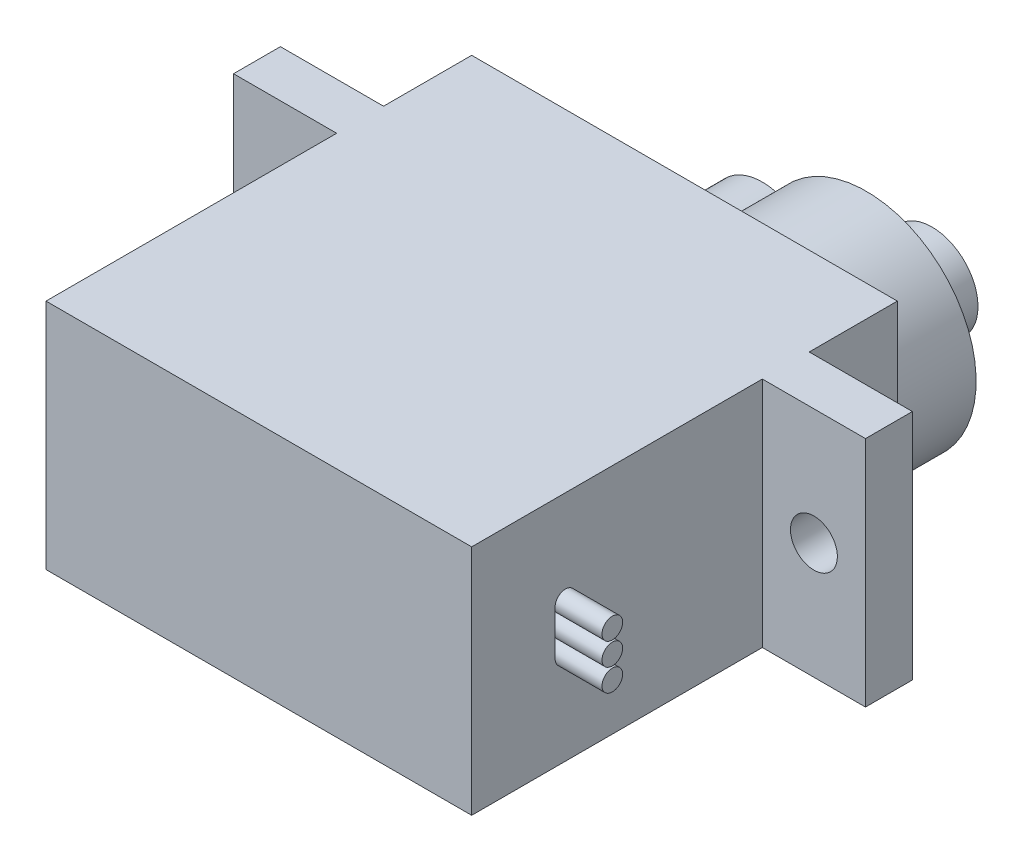
ISO-10303-21;
HEADER;
FILE_DESCRIPTION(('STEP AP214'),'2;1');
FILE_NAME('part.step','',(''),(''),'','','');
FILE_SCHEMA(('AUTOMOTIVE_DESIGN { 1 0 10303 214 1 1 1 1 }'));
ENDSEC;
DATA;
#1=APPLICATION_CONTEXT('core data for automotive mechanical design processes');
#2=APPLICATION_PROTOCOL_DEFINITION('international standard','automotive_design',2000,#1);
#3=PRODUCT_CONTEXT('',#1,'mechanical');
#4=PRODUCT('Part','Part','',(#3));
#5=PRODUCT_RELATED_PRODUCT_CATEGORY('part','',(#4));
#6=PRODUCT_DEFINITION_FORMATION('','',#4);
#7=PRODUCT_DEFINITION_CONTEXT('part definition',#1,'design');
#8=PRODUCT_DEFINITION('design','',#6,#7);
#9=PRODUCT_DEFINITION_SHAPE('','',#8);
#10=(LENGTH_UNIT() NAMED_UNIT(*) SI_UNIT(.MILLI.,.METRE.));
#11=(NAMED_UNIT(*) PLANE_ANGLE_UNIT() SI_UNIT($,.RADIAN.));
#12=(NAMED_UNIT(*) SI_UNIT($,.STERADIAN.) SOLID_ANGLE_UNIT());
#13=UNCERTAINTY_MEASURE_WITH_UNIT(LENGTH_MEASURE(1.E-05),#10,'distance_accuracy_value','');
#14=(GEOMETRIC_REPRESENTATION_CONTEXT(3) GLOBAL_UNCERTAINTY_ASSIGNED_CONTEXT((#13)) GLOBAL_UNIT_ASSIGNED_CONTEXT((#10,
#11,#12)) REPRESENTATION_CONTEXT('',''));
#15=CARTESIAN_POINT('',(0.,0.,0.));
#16=DIRECTION('',(0.,0.,1.));
#17=DIRECTION('',(1.,0.,0.));
#18=AXIS2_PLACEMENT_3D('',#15,#16,#17);
#19=CARTESIAN_POINT('',(0.199999999999997,-60.1690603051343,17.7));
#20=DIRECTION('',(-1.,0.,0.));
#21=DIRECTION('',(0.,-1.,0.));
#22=AXIS2_PLACEMENT_3D('',#19,#20,#21);
#23=CYLINDRICAL_SURFACE('',#22,0.549999999999984);
#24=CARTESIAN_POINT('',(0.199999999999997,-60.1690603051343,17.7));
#25=DIRECTION('',(1.,0.,0.));
#26=DIRECTION('',(0.,1.,0.));
#27=AXIS2_PLACEMENT_3D('',#24,#25,#26);
#28=CIRCLE('',#27,0.549999999999984);
#29=CARTESIAN_POINT('',(0.199999999999997,-59.6190603051344,17.7));
#30=VERTEX_POINT('',#29);
#31=EDGE_CURVE('E323',#30,#30,#28,.T.);
#32=ORIENTED_EDGE('',*,*,#31,.F.);
#33=EDGE_LOOP('',(#32));
#34=FACE_BOUND('',#33,.T.);
#35=CARTESIAN_POINT('',(-2.8,-60.1690603051343,17.7));
#36=DIRECTION('',(1.,0.,0.));
#37=DIRECTION('',(0.,1.,0.));
#38=AXIS2_PLACEMENT_3D('',#35,#36,#37);
#39=CIRCLE('',#38,0.549999999999984);
#40=CARTESIAN_POINT('',(-2.8,-59.6190603051344,17.7));
#41=VERTEX_POINT('',#40);
#42=EDGE_CURVE('E20',#41,#41,#39,.T.);
#43=ORIENTED_EDGE('',*,*,#42,.T.);
#44=EDGE_LOOP('',(#43));
#45=FACE_BOUND('',#44,.T.);
#46=ADVANCED_FACE('F18',(#34,#45),#23,.T.);
#47=CARTESIAN_POINT('',(0.199999999999997,-60.1690603051343,17.7));
#48=DIRECTION('',(1.,0.,0.));
#49=DIRECTION('',(0.,1.,0.));
#50=AXIS2_PLACEMENT_3D('',#47,#48,#49);
#51=PLANE('',#50);
#52=ORIENTED_EDGE('',*,*,#31,.T.);
#53=EDGE_LOOP('',(#52));
#54=FACE_BOUND('',#53,.T.);
#55=ADVANCED_FACE('F453',(#54),#51,.T.);
#56=CARTESIAN_POINT('',(-2.8,-60.1690603051343,17.7));
#57=DIRECTION('',(1.,0.,0.));
#58=DIRECTION('',(0.,1.,0.));
#59=AXIS2_PLACEMENT_3D('',#56,#57,#58);
#60=PLANE('',#59);
#61=ORIENTED_EDGE('',*,*,#42,.F.);
#62=EDGE_LOOP('',(#61));
#63=FACE_BOUND('',#62,.T.);
#64=ADVANCED_FACE('F449',(#63),#60,.F.);
#65=CLOSED_SHELL('',(#46,#55,#64));
#66=MANIFOLD_SOLID_BREP('B1',#65);
#67=CARTESIAN_POINT('',(-25.,-53.9690603051343,22.7));
#68=DIRECTION('',(1.,0.,0.));
#69=DIRECTION('',(0.,0.,-1.));
#70=AXIS2_PLACEMENT_3D('',#67,#68,#69);
#71=PLANE('',#70);
#72=DIRECTION('',(0.,0.,-1.));
#73=VECTOR('',#72,1.);
#74=CARTESIAN_POINT('',(-25.,-66.3690603051343,22.7));
#75=LINE('',#74,#73);
#76=CARTESIAN_POINT('',(-25.0000000000419,-66.3690603051344,4.7));
#77=VERTEX_POINT('',#76);
#78=CARTESIAN_POINT('',(-25.,-66.3690603051343,0.));
#79=VERTEX_POINT('',#78);
#80=EDGE_CURVE('E437',#77,#79,#75,.T.);
#81=ORIENTED_EDGE('',*,*,#80,.F.);
#82=DIRECTION('',(0.,1.,0.));
#83=VECTOR('',#82,1.);
#84=CARTESIAN_POINT('',(-25.0000000000419,-66.3690603051344,4.7));
#85=LINE('',#84,#83);
#86=CARTESIAN_POINT('',(-25.0000000000419,-53.9690603051344,4.7));
#87=VERTEX_POINT('',#86);
#88=EDGE_CURVE('E245',#77,#87,#85,.T.);
#89=ORIENTED_EDGE('',*,*,#88,.T.);
#90=DIRECTION('',(0.,0.,-1.));
#91=VECTOR('',#90,1.);
#92=CARTESIAN_POINT('',(-25.,-53.9690603051343,22.7));
#93=LINE('',#92,#91);
#94=CARTESIAN_POINT('',(-25.,-53.9690603051343,0.));
#95=VERTEX_POINT('',#94);
#96=EDGE_CURVE('E405',#87,#95,#93,.T.);
#97=ORIENTED_EDGE('',*,*,#96,.T.);
#98=DIRECTION('',(0.,-1.,0.));
#99=VECTOR('',#98,1.);
#100=CARTESIAN_POINT('',(-25.,-53.9690603051343,0.));
#101=LINE('',#100,#99);
#102=EDGE_CURVE('E390',#95,#79,#101,.T.);
#103=ORIENTED_EDGE('',*,*,#102,.T.);
#104=EDGE_LOOP('',(#81,#89,#97,#103));
#105=FACE_BOUND('',#104,.T.);
#106=ADVANCED_FACE('F16',(#105),#71,.F.);
#107=CARTESIAN_POINT('',(-2.3,-66.3690603051343,22.7));
#108=DIRECTION('',(-1.,0.,0.));
#109=DIRECTION('',(0.,0.,1.));
#110=AXIS2_PLACEMENT_3D('',#107,#108,#109);
#111=PLANE('',#110);
#112=CARTESIAN_POINT('',(-2.3,-61.3690603051343,17.7));
#113=DIRECTION('',(-1.,0.,0.));
#114=DIRECTION('',(0.,1.,0.));
#115=AXIS2_PLACEMENT_3D('',#112,#113,#114);
#116=CIRCLE('',#115,0.55);
#117=CARTESIAN_POINT('',(-2.3,-61.3690603051343,17.15));
#118=VERTEX_POINT('',#117);
#119=CARTESIAN_POINT('',(-2.3,-61.3690603051343,18.25));
#120=VERTEX_POINT('',#119);
#121=EDGE_CURVE('E327',#118,#120,#116,.T.);
#122=ORIENTED_EDGE('',*,*,#121,.T.);
#123=DIRECTION('',(0.,1.,0.));
#124=VECTOR('',#123,1.);
#125=CARTESIAN_POINT('',(-2.3,-61.3690603051343,18.25));
#126=LINE('',#125,#124);
#127=CARTESIAN_POINT('',(-2.3,-58.9690603051344,18.25));
#128=VERTEX_POINT('',#127);
#129=EDGE_CURVE('E340',#120,#128,#126,.T.);
#130=ORIENTED_EDGE('',*,*,#129,.T.);
#131=CARTESIAN_POINT('',(-2.3,-58.9690603051344,17.7));
#132=DIRECTION('',(-1.,0.,0.));
#133=DIRECTION('',(0.,1.,0.));
#134=AXIS2_PLACEMENT_3D('',#131,#132,#133);
#135=CIRCLE('',#134,0.55);
#136=CARTESIAN_POINT('',(-2.3,-58.9690603051344,17.15));
#137=VERTEX_POINT('',#136);
#138=EDGE_CURVE('E344',#128,#137,#135,.T.);
#139=ORIENTED_EDGE('',*,*,#138,.T.);
#140=DIRECTION('',(0.,-1.,0.));
#141=VECTOR('',#140,1.);
#142=CARTESIAN_POINT('',(-2.3,-58.9690603051344,17.15));
#143=LINE('',#142,#141);
#144=EDGE_CURVE('E335',#137,#118,#143,.T.);
#145=ORIENTED_EDGE('',*,*,#144,.T.);
#146=EDGE_LOOP('',(#122,#130,#139,#145));
#147=FACE_BOUND('',#146,.T.);
#148=DIRECTION('',(0.,-1.,0.));
#149=VECTOR('',#148,1.);
#150=CARTESIAN_POINT('',(-2.29999999995811,-53.9690603051343,7.2));
#151=LINE('',#150,#149);
#152=CARTESIAN_POINT('',(-2.29999999995811,-53.9690603051343,7.2));
#153=VERTEX_POINT('',#152);
#154=CARTESIAN_POINT('',(-2.29999999995811,-66.3690603051343,7.2));
#155=VERTEX_POINT('',#154);
#156=EDGE_CURVE('E298',#153,#155,#151,.T.);
#157=ORIENTED_EDGE('',*,*,#156,.F.);
#158=DIRECTION('',(0.,0.,-1.));
#159=VECTOR('',#158,1.);
#160=CARTESIAN_POINT('',(-2.3,-53.9690603051343,22.7));
#161=LINE('',#160,#159);
#162=CARTESIAN_POINT('',(-2.3,-53.9690603051343,22.7));
#163=VERTEX_POINT('',#162);
#164=EDGE_CURVE('E428',#163,#153,#161,.T.);
#165=ORIENTED_EDGE('',*,*,#164,.F.);
#166=DIRECTION('',(0.,1.,0.));
#167=VECTOR('',#166,1.);
#168=CARTESIAN_POINT('',(-2.3,-66.3690603051343,22.7));
#169=LINE('',#168,#167);
#170=CARTESIAN_POINT('',(-2.3,-66.3690603051343,22.7));
#171=VERTEX_POINT('',#170);
#172=EDGE_CURVE('E398',#171,#163,#169,.T.);
#173=ORIENTED_EDGE('',*,*,#172,.F.);
#174=DIRECTION('',(0.,0.,-1.));
#175=VECTOR('',#174,1.);
#176=CARTESIAN_POINT('',(-2.3,-66.3690603051343,22.7));
#177=LINE('',#176,#175);
#178=EDGE_CURVE('E433',#171,#155,#177,.T.);
#179=ORIENTED_EDGE('',*,*,#178,.T.);
#180=EDGE_LOOP('',(#157,#165,#173,#179));
#181=FACE_BOUND('',#180,.T.);
#182=ADVANCED_FACE('F507',(#147,#181),#111,.F.);
#183=DIRECTION('',(0.,1.,0.));
#184=VECTOR('',#183,1.);
#185=CARTESIAN_POINT('',(-2.29999999995811,-66.3690603051343,4.7));
#186=LINE('',#185,#184);
#187=CARTESIAN_POINT('',(-2.29999999995811,-66.3690603051343,4.7));
#188=VERTEX_POINT('',#187);
#189=CARTESIAN_POINT('',(-2.3,-53.9690603051343,4.7));
#190=VERTEX_POINT('',#189);
#191=EDGE_CURVE('E281',#188,#190,#186,.T.);
#192=ORIENTED_EDGE('',*,*,#191,.F.);
#193=CARTESIAN_POINT('',(-2.3,-66.3690603051343,0.));
#194=VERTEX_POINT('',#193);
#195=EDGE_CURVE('E432',#188,#194,#177,.T.);
#196=ORIENTED_EDGE('',*,*,#195,.T.);
#197=DIRECTION('',(0.,1.,0.));
#198=VECTOR('',#197,1.);
#199=CARTESIAN_POINT('',(-2.3,-66.3690603051343,0.));
#200=LINE('',#199,#198);
#201=CARTESIAN_POINT('',(-2.3,-53.9690603051343,0.));
#202=VERTEX_POINT('',#201);
#203=EDGE_CURVE('E413',#194,#202,#200,.T.);
#204=ORIENTED_EDGE('',*,*,#203,.T.);
#205=EDGE_CURVE('E427',#190,#202,#161,.T.);
#206=ORIENTED_EDGE('',*,*,#205,.F.);
#207=EDGE_LOOP('',(#192,#196,#204,#206));
#208=FACE_BOUND('',#207,.T.);
#209=ADVANCED_FACE('F502',(#208),#111,.F.);
#210=CARTESIAN_POINT('',(-2.8,-61.3690603051343,17.7));
#211=DIRECTION('',(-1.,0.,0.));
#212=DIRECTION('',(0.,1.,0.));
#213=AXIS2_PLACEMENT_3D('',#210,#211,#212);
#214=PLANE('',#213);
#215=CARTESIAN_POINT('',(-2.8,-61.3690603051343,17.7));
#216=DIRECTION('',(1.,0.,0.));
#217=DIRECTION('',(0.,1.,0.));
#218=AXIS2_PLACEMENT_3D('',#215,#216,#217);
#219=CIRCLE('',#218,0.549999999999984);
#220=CARTESIAN_POINT('',(-2.8,-61.3690603051343,17.15));
#221=VERTEX_POINT('',#220);
#222=CARTESIAN_POINT('',(-2.8,-61.3690603051343,18.25));
#223=VERTEX_POINT('',#222);
#224=EDGE_CURVE('E320',#221,#223,#219,.T.);
#225=ORIENTED_EDGE('',*,*,#224,.F.);
#226=DIRECTION('',(0.,-1.,0.));
#227=VECTOR('',#226,1.);
#228=CARTESIAN_POINT('',(-2.8,-58.9690603051344,17.15));
#229=LINE('',#228,#227);
#230=CARTESIAN_POINT('',(-2.8,-58.9690603051344,17.15));
#231=VERTEX_POINT('',#230);
#232=EDGE_CURVE('E334',#231,#221,#229,.T.);
#233=ORIENTED_EDGE('',*,*,#232,.F.);
#234=CARTESIAN_POINT('',(-2.8,-58.9690603051344,17.7));
#235=DIRECTION('',(1.,0.,0.));
#236=DIRECTION('',(0.,1.,0.));
#237=AXIS2_PLACEMENT_3D('',#234,#235,#236);
#238=CIRCLE('',#237,0.549999999999984);
#239=CARTESIAN_POINT('',(-2.8,-58.9690603051344,18.25));
#240=VERTEX_POINT('',#239);
#241=EDGE_CURVE('E319',#240,#231,#238,.T.);
#242=ORIENTED_EDGE('',*,*,#241,.F.);
#243=DIRECTION('',(0.,1.,0.));
#244=VECTOR('',#243,1.);
#245=CARTESIAN_POINT('',(-2.8,-61.3690603051343,18.25));
#246=LINE('',#245,#244);
#247=EDGE_CURVE('E330',#223,#240,#246,.T.);
#248=ORIENTED_EDGE('',*,*,#247,.F.);
#249=EDGE_LOOP('',(#225,#233,#242,#248));
#250=FACE_BOUND('',#249,.T.);
#251=ADVANCED_FACE('F506',(#250),#214,.F.);
#252=CARTESIAN_POINT('',(-8.65,-60.2733667044182,-4.7));
#253=DIRECTION('',(0.,0.,1.));
#254=DIRECTION('',(-1.,0.,0.));
#255=AXIS2_PLACEMENT_3D('',#252,#253,#254);
#256=CYLINDRICAL_SURFACE('',#255,5.85);
#257=DIRECTION('',(0.,0.,1.));
#258=VECTOR('',#257,1.);
#259=CARTESIAN_POINT('',(-14.1122706823838,-62.3676682568149,-2.35));
#260=LINE('',#259,#258);
#261=CARTESIAN_POINT('',(-14.1122706823838,-62.3676682568149,-4.7));
#262=VERTEX_POINT('',#261);
#263=CARTESIAN_POINT('',(-14.1122706823838,-62.3676682568149,0.));
#264=VERTEX_POINT('',#263);
#265=EDGE_CURVE('E379',#262,#264,#260,.T.);
#266=ORIENTED_EDGE('',*,*,#265,.F.);
#267=CARTESIAN_POINT('',(-8.65,-60.2733667044182,-4.7));
#268=DIRECTION('',(0.,0.,-1.));
#269=DIRECTION('',(1.,0.,0.));
#270=AXIS2_PLACEMENT_3D('',#267,#268,#269);
#271=CIRCLE('',#270,5.85);
#272=CARTESIAN_POINT('',(-13.4159898873785,-56.8810459068806,-4.7));
#273=VERTEX_POINT('',#272);
#274=EDGE_CURVE('E385',#273,#262,#271,.T.);
#275=ORIENTED_EDGE('',*,*,#274,.F.);
#276=DIRECTION('',(0.,0.,1.));
#277=VECTOR('',#276,1.);
#278=CARTESIAN_POINT('',(-13.4159898873785,-56.8810459068806,-2.35));
#279=LINE('',#278,#277);
#280=CARTESIAN_POINT('',(-13.4159898873785,-56.8810459068806,0.));
#281=VERTEX_POINT('',#280);
#282=EDGE_CURVE('E372',#281,#273,#279,.F.);
#283=ORIENTED_EDGE('',*,*,#282,.F.);
#284=CARTESIAN_POINT('',(-8.65,-60.2733667044182,0.));
#285=DIRECTION('',(0.,0.,-1.));
#286=DIRECTION('',(1.,0.,0.));
#287=AXIS2_PLACEMENT_3D('',#284,#285,#286);
#288=CIRCLE('',#287,5.85);
#289=EDGE_CURVE('E27',#281,#264,#288,.T.);
#290=ORIENTED_EDGE('',*,*,#289,.T.);
#291=EDGE_LOOP('',(#266,#275,#283,#290));
#292=FACE_BOUND('',#291,.T.);
#293=ADVANCED_FACE('F527',(#292),#256,.T.);
#294=CARTESIAN_POINT('',(-25.,-53.9690603051343,22.7));
#295=VERTEX_POINT('',#294);
#296=CARTESIAN_POINT('',(-25.0000000000419,-53.9690603051344,7.2));
#297=VERTEX_POINT('',#296);
#298=EDGE_CURVE('E423',#295,#297,#93,.T.);
#299=ORIENTED_EDGE('',*,*,#298,.T.);
#300=DIRECTION('',(0.,-1.,0.));
#301=VECTOR('',#300,1.);
#302=CARTESIAN_POINT('',(-25.0000000000419,-53.9690603051344,7.2));
#303=LINE('',#302,#301);
#304=CARTESIAN_POINT('',(-25.,-66.3690603051343,7.2));
#305=VERTEX_POINT('',#304);
#306=EDGE_CURVE('E258',#297,#305,#303,.T.);
#307=ORIENTED_EDGE('',*,*,#306,.T.);
#308=CARTESIAN_POINT('',(-25.,-66.3690603051343,22.7));
#309=VERTEX_POINT('',#308);
#310=EDGE_CURVE('E394',#309,#305,#75,.T.);
#311=ORIENTED_EDGE('',*,*,#310,.F.);
#312=DIRECTION('',(0.,-1.,0.));
#313=VECTOR('',#312,1.);
#314=CARTESIAN_POINT('',(-25.,-53.9690603051343,22.7));
#315=LINE('',#314,#313);
#316=EDGE_CURVE('E399',#295,#309,#315,.T.);
#317=ORIENTED_EDGE('',*,*,#316,.F.);
#318=EDGE_LOOP('',(#299,#307,#311,#317));
#319=FACE_BOUND('',#318,.T.);
#320=ADVANCED_FACE('F519',(#319),#71,.F.);
#321=CARTESIAN_POINT('',(-25.,-66.3690603051343,22.7));
#322=DIRECTION('',(0.,1.,0.));
#323=DIRECTION('',(0.,0.,1.));
#324=AXIS2_PLACEMENT_3D('',#321,#322,#323);
#325=PLANE('',#324);
#326=DIRECTION('',(1.,0.,0.));
#327=VECTOR('',#326,1.);
#328=CARTESIAN_POINT('',(-25.,-66.3690603051343,0.));
#329=LINE('',#328,#327);
#330=EDGE_CURVE('E410',#79,#194,#329,.T.);
#331=ORIENTED_EDGE('',*,*,#330,.T.);
#332=ORIENTED_EDGE('',*,*,#195,.F.);
#333=DIRECTION('',(-1.,0.,0.));
#334=VECTOR('',#333,1.);
#335=CARTESIAN_POINT('',(3.20000000004189,-66.3690603051343,4.7));
#336=LINE('',#335,#334);
#337=CARTESIAN_POINT('',(3.20000000004189,-66.3690603051343,4.7));
#338=VERTEX_POINT('',#337);
#339=EDGE_CURVE('E313',#338,#188,#336,.T.);
#340=ORIENTED_EDGE('',*,*,#339,.F.);
#341=DIRECTION('',(0.,0.,-1.));
#342=VECTOR('',#341,1.);
#343=CARTESIAN_POINT('',(3.20000000004189,-66.3690603051343,7.2));
#344=LINE('',#343,#342);
#345=CARTESIAN_POINT('',(3.20000000004189,-66.3690603051343,7.2));
#346=VERTEX_POINT('',#345);
#347=EDGE_CURVE('E288',#346,#338,#344,.T.);
#348=ORIENTED_EDGE('',*,*,#347,.F.);
#349=DIRECTION('',(-1.,0.,0.));
#350=VECTOR('',#349,1.);
#351=CARTESIAN_POINT('',(3.20000000004189,-66.3690603051343,7.2));
#352=LINE('',#351,#350);
#353=EDGE_CURVE('E294',#346,#155,#352,.T.);
#354=ORIENTED_EDGE('',*,*,#353,.T.);
#355=ORIENTED_EDGE('',*,*,#178,.F.);
#356=DIRECTION('',(1.,0.,0.));
#357=VECTOR('',#356,1.);
#358=CARTESIAN_POINT('',(-25.,-66.3690603051343,22.7));
#359=LINE('',#358,#357);
#360=EDGE_CURVE('E395',#309,#171,#359,.T.);
#361=ORIENTED_EDGE('',*,*,#360,.F.);
#362=ORIENTED_EDGE('',*,*,#310,.T.);
#363=DIRECTION('',(1.,0.,0.));
#364=VECTOR('',#363,1.);
#365=CARTESIAN_POINT('',(-30.5000000000419,-66.3690603051344,7.2));
#366=LINE('',#365,#364);
#367=CARTESIAN_POINT('',(-30.5000000000419,-66.3690603051344,7.2));
#368=VERTEX_POINT('',#367);
#369=EDGE_CURVE('E256',#368,#305,#366,.T.);
#370=ORIENTED_EDGE('',*,*,#369,.F.);
#371=DIRECTION('',(0.,0.,-1.));
#372=VECTOR('',#371,1.);
#373=CARTESIAN_POINT('',(-30.5000000000419,-66.3690603051344,7.2));
#374=LINE('',#373,#372);
#375=CARTESIAN_POINT('',(-30.5000000000419,-66.3690603051344,4.7));
#376=VERTEX_POINT('',#375);
#377=EDGE_CURVE('E233',#368,#376,#374,.T.);
#378=ORIENTED_EDGE('',*,*,#377,.T.);
#379=DIRECTION('',(1.,0.,0.));
#380=VECTOR('',#379,1.);
#381=CARTESIAN_POINT('',(-30.5000000000419,-66.3690603051344,4.7));
#382=LINE('',#381,#380);
#383=EDGE_CURVE('E241',#376,#77,#382,.T.);
#384=ORIENTED_EDGE('',*,*,#383,.T.);
#385=ORIENTED_EDGE('',*,*,#80,.T.);
#386=EDGE_LOOP('',(#331,#332,#340,#348,#354,#355,#361,#362,#370,#378,#384,#385));
#387=FACE_BOUND('',#386,.T.);
#388=ADVANCED_FACE('F254',(#387),#325,.F.);
#389=CARTESIAN_POINT('',(-2.3,-53.9690603051343,22.7));
#390=DIRECTION('',(0.,-1.,0.));
#391=DIRECTION('',(0.,0.,-1.));
#392=AXIS2_PLACEMENT_3D('',#389,#390,#391);
#393=PLANE('',#392);
#394=DIRECTION('',(-1.,0.,0.));
#395=VECTOR('',#394,1.);
#396=CARTESIAN_POINT('',(-2.3,-53.9690603051343,0.));
#397=LINE('',#396,#395);
#398=EDGE_CURVE('E409',#202,#95,#397,.T.);
#399=ORIENTED_EDGE('',*,*,#398,.T.);
#400=ORIENTED_EDGE('',*,*,#96,.F.);
#401=DIRECTION('',(1.,0.,0.));
#402=VECTOR('',#401,1.);
#403=CARTESIAN_POINT('',(-30.5000000000419,-53.9690603051344,4.7));
#404=LINE('',#403,#402);
#405=CARTESIAN_POINT('',(-30.5000000000419,-53.9690603051344,4.7));
#406=VERTEX_POINT('',#405);
#407=EDGE_CURVE('E250',#406,#87,#404,.T.);
#408=ORIENTED_EDGE('',*,*,#407,.F.);
#409=DIRECTION('',(0.,0.,1.));
#410=VECTOR('',#409,1.);
#411=CARTESIAN_POINT('',(-30.5000000000419,-53.9690603051344,4.7));
#412=LINE('',#411,#410);
#413=CARTESIAN_POINT('',(-30.5000000000419,-53.9690603051344,7.2));
#414=VERTEX_POINT('',#413);
#415=EDGE_CURVE('E236',#406,#414,#412,.T.);
#416=ORIENTED_EDGE('',*,*,#415,.T.);
#417=DIRECTION('',(1.,0.,0.));
#418=VECTOR('',#417,1.);
#419=CARTESIAN_POINT('',(-30.5000000000419,-53.9690603051344,7.2));
#420=LINE('',#419,#418);
#421=EDGE_CURVE('E272',#414,#297,#420,.T.);
#422=ORIENTED_EDGE('',*,*,#421,.T.);
#423=ORIENTED_EDGE('',*,*,#298,.F.);
#424=DIRECTION('',(-1.,0.,0.));
#425=VECTOR('',#424,1.);
#426=CARTESIAN_POINT('',(-2.3,-53.9690603051343,22.7));
#427=LINE('',#426,#425);
#428=EDGE_CURVE('E402',#163,#295,#427,.T.);
#429=ORIENTED_EDGE('',*,*,#428,.F.);
#430=ORIENTED_EDGE('',*,*,#164,.T.);
#431=DIRECTION('',(-1.,0.,0.));
#432=VECTOR('',#431,1.);
#433=CARTESIAN_POINT('',(3.20000000004189,-53.9690603051343,7.2));
#434=LINE('',#433,#432);
#435=CARTESIAN_POINT('',(3.20000000004189,-53.9690603051343,7.2));
#436=VERTEX_POINT('',#435);
#437=EDGE_CURVE('E307',#436,#153,#434,.T.);
#438=ORIENTED_EDGE('',*,*,#437,.F.);
#439=DIRECTION('',(0.,0.,1.));
#440=VECTOR('',#439,1.);
#441=CARTESIAN_POINT('',(3.20000000004189,-53.9690603051343,4.7));
#442=LINE('',#441,#440);
#443=CARTESIAN_POINT('',(3.20000000004189,-53.9690603051343,4.7));
#444=VERTEX_POINT('',#443);
#445=EDGE_CURVE('E287',#444,#436,#442,.T.);
#446=ORIENTED_EDGE('',*,*,#445,.F.);
#447=DIRECTION('',(-1.,0.,0.));
#448=VECTOR('',#447,1.);
#449=CARTESIAN_POINT('',(3.20000000004189,-53.9690603051343,4.7));
#450=LINE('',#449,#448);
#451=EDGE_CURVE('E310',#444,#190,#450,.T.);
#452=ORIENTED_EDGE('',*,*,#451,.T.);
#453=ORIENTED_EDGE('',*,*,#205,.T.);
#454=EDGE_LOOP('',(#399,#400,#408,#416,#422,#423,#429,#430,#438,#446,#452,#453));
#455=FACE_BOUND('',#454,.T.);
#456=ADVANCED_FACE('F536',(#455),#393,.F.);
#457=CARTESIAN_POINT('',(-25.,-66.3690603051343,22.7));
#458=DIRECTION('',(0.,0.,1.));
#459=DIRECTION('',(1.,0.,0.));
#460=AXIS2_PLACEMENT_3D('',#457,#458,#459);
#461=PLANE('',#460);
#462=ORIENTED_EDGE('',*,*,#316,.T.);
#463=ORIENTED_EDGE('',*,*,#360,.T.);
#464=ORIENTED_EDGE('',*,*,#172,.T.);
#465=ORIENTED_EDGE('',*,*,#428,.T.);
#466=EDGE_LOOP('',(#462,#463,#464,#465));
#467=FACE_BOUND('',#466,.T.);
#468=ADVANCED_FACE('F550',(#467),#461,.T.);
#469=CARTESIAN_POINT('',(-25.,-66.3690603051343,0.));
#470=DIRECTION('',(0.,0.,1.));
#471=DIRECTION('',(1.,0.,0.));
#472=AXIS2_PLACEMENT_3D('',#469,#470,#471);
#473=PLANE('',#472);
#474=CARTESIAN_POINT('',(-14.2,-59.5690429573454,0.));
#475=DIRECTION('',(0.,0.,-1.));
#476=DIRECTION('',(1.,0.,0.));
#477=AXIS2_PLACEMENT_3D('',#474,#475,#476);
#478=CIRCLE('',#477,2.8);
#479=EDGE_CURVE('E367',#264,#281,#478,.T.);
#480=ORIENTED_EDGE('',*,*,#479,.F.);
#481=ORIENTED_EDGE('',*,*,#289,.F.);
#482=EDGE_LOOP('',(#480,#481));
#483=FACE_BOUND('',#482,.T.);
#484=ORIENTED_EDGE('',*,*,#102,.F.);
#485=ORIENTED_EDGE('',*,*,#398,.F.);
#486=ORIENTED_EDGE('',*,*,#203,.F.);
#487=ORIENTED_EDGE('',*,*,#330,.F.);
#488=EDGE_LOOP('',(#484,#485,#486,#487));
#489=FACE_BOUND('',#488,.T.);
#490=ADVANCED_FACE('F557',(#483,#489),#473,.F.);
#491=CARTESIAN_POINT('',(-8.65,-60.2733667044182,-4.7));
#492=DIRECTION('',(0.,0.,-1.));
#493=DIRECTION('',(1.,0.,0.));
#494=AXIS2_PLACEMENT_3D('',#491,#492,#493);
#495=PLANE('',#494);
#496=ORIENTED_EDGE('',*,*,#274,.T.);
#497=CARTESIAN_POINT('',(-14.2,-59.5690429573454,-4.7));
#498=DIRECTION('',(0.,0.,-1.));
#499=DIRECTION('',(1.,0.,0.));
#500=AXIS2_PLACEMENT_3D('',#497,#498,#499);
#501=CIRCLE('',#500,2.8);
#502=EDGE_CURVE('E368',#262,#273,#501,.T.);
#503=ORIENTED_EDGE('',*,*,#502,.T.);
#504=EDGE_LOOP('',(#496,#503));
#505=FACE_BOUND('',#504,.T.);
#506=CARTESIAN_POINT('',(-8.65,-60.2733667044182,-4.7));
#507=DIRECTION('',(0.,0.,-1.));
#508=DIRECTION('',(1.,0.,0.));
#509=AXIS2_PLACEMENT_3D('',#506,#507,#508);
#510=CIRCLE('',#509,2.45);
#511=CARTESIAN_POINT('',(-6.2,-60.2733667044182,-4.7));
#512=VERTEX_POINT('',#511);
#513=EDGE_CURVE('E11',#512,#512,#510,.T.);
#514=ORIENTED_EDGE('',*,*,#513,.F.);
#515=EDGE_LOOP('',(#514));
#516=FACE_BOUND('',#515,.T.);
#517=ADVANCED_FACE('F561',(#505,#516),#495,.T.);
#518=CARTESIAN_POINT('',(-8.65,-60.2733667044182,-8.2));
#519=DIRECTION('',(0.,0.,1.));
#520=DIRECTION('',(-1.,0.,0.));
#521=AXIS2_PLACEMENT_3D('',#518,#519,#520);
#522=CYLINDRICAL_SURFACE('',#521,2.45);
#523=CARTESIAN_POINT('',(-8.65,-60.2733667044182,-8.2));
#524=DIRECTION('',(0.,0.,-1.));
#525=DIRECTION('',(1.,0.,0.));
#526=AXIS2_PLACEMENT_3D('',#523,#524,#525);
#527=CIRCLE('',#526,2.45);
#528=CARTESIAN_POINT('',(-6.2,-60.2733667044182,-8.2));
#529=VERTEX_POINT('',#528);
#530=EDGE_CURVE('E383',#529,#529,#527,.T.);
#531=ORIENTED_EDGE('',*,*,#530,.F.);
#532=EDGE_LOOP('',(#531));
#533=FACE_BOUND('',#532,.T.);
#534=ORIENTED_EDGE('',*,*,#513,.T.);
#535=EDGE_LOOP('',(#534));
#536=FACE_BOUND('',#535,.T.);
#537=ADVANCED_FACE('F584',(#533,#536),#522,.T.);
#538=CARTESIAN_POINT('',(-8.65,-60.2733667044182,-8.2));
#539=DIRECTION('',(0.,0.,-1.));
#540=DIRECTION('',(1.,0.,0.));
#541=AXIS2_PLACEMENT_3D('',#538,#539,#540);
#542=PLANE('',#541);
#543=CARTESIAN_POINT('',(-8.65,-60.2733667044182,-8.2));
#544=DIRECTION('',(0.,0.,1.));
#545=DIRECTION('',(1.,0.,0.));
#546=AXIS2_PLACEMENT_3D('',#543,#544,#545);
#547=CIRCLE('',#546,0.9);
#548=CARTESIAN_POINT('',(-7.75,-60.2733667044182,-8.2));
#549=VERTEX_POINT('',#548);
#550=EDGE_CURVE('E36',#549,#549,#547,.T.);
#551=ORIENTED_EDGE('',*,*,#550,.T.);
#552=EDGE_LOOP('',(#551));
#553=FACE_BOUND('',#552,.T.);
#554=ORIENTED_EDGE('',*,*,#530,.T.);
#555=EDGE_LOOP('',(#554));
#556=FACE_BOUND('',#555,.T.);
#557=ADVANCED_FACE('F593',(#553,#556),#542,.T.);
#558=CARTESIAN_POINT('',(-14.2,-59.5690429573454,-4.7));
#559=DIRECTION('',(0.,0.,1.));
#560=DIRECTION('',(-1.,0.,0.));
#561=AXIS2_PLACEMENT_3D('',#558,#559,#560);
#562=CYLINDRICAL_SURFACE('',#561,2.8);
#563=ORIENTED_EDGE('',*,*,#502,.F.);
#564=ORIENTED_EDGE('',*,*,#265,.T.);
#565=ORIENTED_EDGE('',*,*,#479,.T.);
#566=ORIENTED_EDGE('',*,*,#282,.T.);
#567=EDGE_LOOP('',(#563,#564,#565,#566));
#568=FACE_BOUND('',#567,.T.);
#569=ADVANCED_FACE('F602',(#568),#562,.T.);
#570=CARTESIAN_POINT('',(-2.8,-61.3690603051343,18.25));
#571=DIRECTION('',(0.,0.,-1.));
#572=DIRECTION('',(-1.,0.,0.));
#573=AXIS2_PLACEMENT_3D('',#570,#571,#572);
#574=PLANE('',#573);
#575=ORIENTED_EDGE('',*,*,#129,.F.);
#576=DIRECTION('',(1.,0.,0.));
#577=VECTOR('',#576,1.);
#578=CARTESIAN_POINT('',(-2.8,-61.3690603051343,18.25));
#579=LINE('',#578,#577);
#580=EDGE_CURVE('E364',#223,#120,#579,.T.);
#581=ORIENTED_EDGE('',*,*,#580,.F.);
#582=ORIENTED_EDGE('',*,*,#247,.T.);
#583=DIRECTION('',(1.,0.,0.));
#584=VECTOR('',#583,1.);
#585=CARTESIAN_POINT('',(-2.8,-58.9690603051344,18.25));
#586=LINE('',#585,#584);
#587=EDGE_CURVE('E360',#240,#128,#586,.T.);
#588=ORIENTED_EDGE('',*,*,#587,.T.);
#589=EDGE_LOOP('',(#575,#581,#582,#588));
#590=FACE_BOUND('',#589,.T.);
#591=ADVANCED_FACE('F610',(#590),#574,.T.);
#592=CARTESIAN_POINT('',(-2.8,-58.9690603051344,17.15));
#593=DIRECTION('',(0.,0.,1.));
#594=DIRECTION('',(1.,0.,0.));
#595=AXIS2_PLACEMENT_3D('',#592,#593,#594);
#596=PLANE('',#595);
#597=ORIENTED_EDGE('',*,*,#144,.F.);
#598=DIRECTION('',(1.,0.,0.));
#599=VECTOR('',#598,1.);
#600=CARTESIAN_POINT('',(-2.8,-58.9690603051344,17.15));
#601=LINE('',#600,#599);
#602=EDGE_CURVE('E357',#231,#137,#601,.T.);
#603=ORIENTED_EDGE('',*,*,#602,.F.);
#604=ORIENTED_EDGE('',*,*,#232,.T.);
#605=DIRECTION('',(1.,0.,0.));
#606=VECTOR('',#605,1.);
#607=CARTESIAN_POINT('',(-2.8,-61.3690603051343,17.15));
#608=LINE('',#607,#606);
#609=EDGE_CURVE('E339',#221,#118,#608,.T.);
#610=ORIENTED_EDGE('',*,*,#609,.T.);
#611=EDGE_LOOP('',(#597,#603,#604,#610));
#612=FACE_BOUND('',#611,.T.);
#613=ADVANCED_FACE('F619',(#612),#596,.T.);
#614=CARTESIAN_POINT('',(0.199999999999997,-58.9690603051344,17.7));
#615=DIRECTION('',(-1.,0.,0.));
#616=DIRECTION('',(0.,-1.,0.));
#617=AXIS2_PLACEMENT_3D('',#614,#615,#616);
#618=CYLINDRICAL_SURFACE('',#617,0.549999999999984);
#619=ORIENTED_EDGE('',*,*,#587,.F.);
#620=ORIENTED_EDGE('',*,*,#241,.T.);
#621=ORIENTED_EDGE('',*,*,#602,.T.);
#622=ORIENTED_EDGE('',*,*,#138,.F.);
#623=EDGE_LOOP('',(#619,#620,#621,#622));
#624=FACE_BOUND('',#623,.T.);
#625=CARTESIAN_POINT('',(0.199999999999997,-58.9690603051344,17.7));
#626=DIRECTION('',(1.,0.,0.));
#627=DIRECTION('',(0.,1.,0.));
#628=AXIS2_PLACEMENT_3D('',#625,#626,#627);
#629=CIRCLE('',#628,0.549999999999984);
#630=CARTESIAN_POINT('',(0.199999999999997,-58.4190603051344,17.7));
#631=VERTEX_POINT('',#630);
#632=EDGE_CURVE('E324',#631,#631,#629,.T.);
#633=ORIENTED_EDGE('',*,*,#632,.F.);
#634=EDGE_LOOP('',(#633));
#635=FACE_BOUND('',#634,.T.);
#636=ADVANCED_FACE('F628',(#624,#635),#618,.T.);
#637=CARTESIAN_POINT('',(0.199999999999997,-58.9690603051344,17.7));
#638=DIRECTION('',(1.,0.,0.));
#639=DIRECTION('',(0.,1.,0.));
#640=AXIS2_PLACEMENT_3D('',#637,#638,#639);
#641=PLANE('',#640);
#642=ORIENTED_EDGE('',*,*,#632,.T.);
#643=EDGE_LOOP('',(#642));
#644=FACE_BOUND('',#643,.T.);
#645=ADVANCED_FACE('F644',(#644),#641,.T.);
#646=CARTESIAN_POINT('',(0.199999999999997,-61.3690603051343,17.7));
#647=DIRECTION('',(-1.,0.,0.));
#648=DIRECTION('',(0.,-1.,0.));
#649=AXIS2_PLACEMENT_3D('',#646,#647,#648);
#650=CYLINDRICAL_SURFACE('',#649,0.549999999999984);
#651=ORIENTED_EDGE('',*,*,#609,.F.);
#652=ORIENTED_EDGE('',*,*,#224,.T.);
#653=ORIENTED_EDGE('',*,*,#580,.T.);
#654=ORIENTED_EDGE('',*,*,#121,.F.);
#655=EDGE_LOOP('',(#651,#652,#653,#654));
#656=FACE_BOUND('',#655,.T.);
#657=CARTESIAN_POINT('',(0.199999999999997,-61.3690603051343,17.7));
#658=DIRECTION('',(1.,0.,0.));
#659=DIRECTION('',(0.,1.,0.));
#660=AXIS2_PLACEMENT_3D('',#657,#658,#659);
#661=CIRCLE('',#660,0.549999999999984);
#662=CARTESIAN_POINT('',(0.199999999999997,-60.8190603051344,17.7));
#663=VERTEX_POINT('',#662);
#664=EDGE_CURVE('E316',#663,#663,#661,.T.);
#665=ORIENTED_EDGE('',*,*,#664,.F.);
#666=EDGE_LOOP('',(#665));
#667=FACE_BOUND('',#666,.T.);
#668=ADVANCED_FACE('F653',(#656,#667),#650,.T.);
#669=CARTESIAN_POINT('',(0.199999999999997,-61.3690603051343,17.7));
#670=DIRECTION('',(1.,0.,0.));
#671=DIRECTION('',(0.,1.,0.));
#672=AXIS2_PLACEMENT_3D('',#669,#670,#671);
#673=PLANE('',#672);
#674=ORIENTED_EDGE('',*,*,#664,.T.);
#675=EDGE_LOOP('',(#674));
#676=FACE_BOUND('',#675,.T.);
#677=ADVANCED_FACE('F662',(#676),#673,.T.);
#678=CARTESIAN_POINT('',(3.20000000004189,-66.3690603051343,4.7));
#679=DIRECTION('',(0.,0.,1.));
#680=DIRECTION('',(1.,0.,0.));
#681=AXIS2_PLACEMENT_3D('',#678,#679,#680);
#682=PLANE('',#681);
#683=CARTESIAN_POINT('',(0.450000000031417,-60.1690603051343,4.7));
#684=DIRECTION('',(0.,0.,1.));
#685=DIRECTION('',(0.,1.,0.));
#686=AXIS2_PLACEMENT_3D('',#683,#684,#685);
#687=CIRCLE('',#686,1.25);
#688=CARTESIAN_POINT('',(0.450000000031417,-58.9190603051343,4.7));
#689=VERTEX_POINT('',#688);
#690=EDGE_CURVE('E249',#689,#689,#687,.T.);
#691=ORIENTED_EDGE('',*,*,#690,.T.);
#692=EDGE_LOOP('',(#691));
#693=FACE_BOUND('',#692,.T.);
#694=ORIENTED_EDGE('',*,*,#191,.T.);
#695=ORIENTED_EDGE('',*,*,#451,.F.);
#696=DIRECTION('',(0.,1.,0.));
#697=VECTOR('',#696,1.);
#698=CARTESIAN_POINT('',(3.20000000004189,-66.3690603051343,4.7));
#699=LINE('',#698,#697);
#700=EDGE_CURVE('E284',#338,#444,#699,.T.);
#701=ORIENTED_EDGE('',*,*,#700,.F.);
#702=ORIENTED_EDGE('',*,*,#339,.T.);
#703=EDGE_LOOP('',(#694,#695,#701,#702));
#704=FACE_BOUND('',#703,.T.);
#705=ADVANCED_FACE('F671',(#693,#704),#682,.F.);
#706=CARTESIAN_POINT('',(3.20000000004189,-53.9690603051343,7.2));
#707=DIRECTION('',(0.,0.,-1.));
#708=DIRECTION('',(-1.,0.,0.));
#709=AXIS2_PLACEMENT_3D('',#706,#707,#708);
#710=PLANE('',#709);
#711=CARTESIAN_POINT('',(0.450000000031417,-60.1690603051343,7.2));
#712=DIRECTION('',(0.,0.,1.));
#713=DIRECTION('',(0.,1.,0.));
#714=AXIS2_PLACEMENT_3D('',#711,#712,#713);
#715=CIRCLE('',#714,1.25);
#716=CARTESIAN_POINT('',(0.450000000031417,-58.9190603051343,7.2));
#717=VERTEX_POINT('',#716);
#718=EDGE_CURVE('E278',#717,#717,#715,.T.);
#719=ORIENTED_EDGE('',*,*,#718,.F.);
#720=EDGE_LOOP('',(#719));
#721=FACE_BOUND('',#720,.T.);
#722=ORIENTED_EDGE('',*,*,#156,.T.);
#723=ORIENTED_EDGE('',*,*,#353,.F.);
#724=DIRECTION('',(0.,-1.,0.));
#725=VECTOR('',#724,1.);
#726=CARTESIAN_POINT('',(3.20000000004189,-53.9690603051343,7.2));
#727=LINE('',#726,#725);
#728=EDGE_CURVE('E291',#436,#346,#727,.T.);
#729=ORIENTED_EDGE('',*,*,#728,.F.);
#730=ORIENTED_EDGE('',*,*,#437,.T.);
#731=EDGE_LOOP('',(#722,#723,#729,#730));
#732=FACE_BOUND('',#731,.T.);
#733=ADVANCED_FACE('F680',(#721,#732),#710,.F.);
#734=CARTESIAN_POINT('',(3.20000000004189,-66.3690603051343,4.7));
#735=DIRECTION('',(1.,0.,0.));
#736=DIRECTION('',(0.,1.,0.));
#737=AXIS2_PLACEMENT_3D('',#734,#735,#736);
#738=PLANE('',#737);
#739=ORIENTED_EDGE('',*,*,#347,.T.);
#740=ORIENTED_EDGE('',*,*,#700,.T.);
#741=ORIENTED_EDGE('',*,*,#445,.T.);
#742=ORIENTED_EDGE('',*,*,#728,.T.);
#743=EDGE_LOOP('',(#739,#740,#741,#742));
#744=FACE_BOUND('',#743,.T.);
#745=ADVANCED_FACE('F689',(#744),#738,.T.);
#746=CARTESIAN_POINT('',(0.450000000031417,-60.1690603051343,7.2));
#747=DIRECTION('',(0.,0.,-1.));
#748=DIRECTION('',(0.,-1.,0.));
#749=AXIS2_PLACEMENT_3D('',#746,#747,#748);
#750=CYLINDRICAL_SURFACE('',#749,1.25);
#751=ORIENTED_EDGE('',*,*,#718,.T.);
#752=EDGE_LOOP('',(#751));
#753=FACE_BOUND('',#752,.T.);
#754=ORIENTED_EDGE('',*,*,#690,.F.);
#755=EDGE_LOOP('',(#754));
#756=FACE_BOUND('',#755,.T.);
#757=ADVANCED_FACE('F698',(#753,#756),#750,.F.);
#758=CARTESIAN_POINT('',(-30.5000000000419,-66.3690603051344,4.7));
#759=DIRECTION('',(0.,0.,1.));
#760=DIRECTION('',(-1.,0.,0.));
#761=AXIS2_PLACEMENT_3D('',#758,#759,#760);
#762=PLANE('',#761);
#763=CARTESIAN_POINT('',(-27.7500000000314,-60.1690603051344,4.7));
#764=DIRECTION('',(0.,0.,-1.));
#765=DIRECTION('',(0.,1.,0.));
#766=AXIS2_PLACEMENT_3D('',#763,#764,#765);
#767=CIRCLE('',#766,1.25);
#768=CARTESIAN_POINT('',(-27.7500000000314,-58.9190603051344,4.7));
#769=VERTEX_POINT('',#768);
#770=EDGE_CURVE('E491',#769,#769,#767,.T.);
#771=ORIENTED_EDGE('',*,*,#770,.F.);
#772=EDGE_LOOP('',(#771));
#773=FACE_BOUND('',#772,.T.);
#774=ORIENTED_EDGE('',*,*,#88,.F.);
#775=ORIENTED_EDGE('',*,*,#383,.F.);
#776=DIRECTION('',(0.,1.,0.));
#777=VECTOR('',#776,1.);
#778=CARTESIAN_POINT('',(-30.5000000000419,-66.3690603051344,4.7));
#779=LINE('',#778,#777);
#780=EDGE_CURVE('E228',#376,#406,#779,.T.);
#781=ORIENTED_EDGE('',*,*,#780,.T.);
#782=ORIENTED_EDGE('',*,*,#407,.T.);
#783=EDGE_LOOP('',(#774,#775,#781,#782));
#784=FACE_BOUND('',#783,.T.);
#785=ADVANCED_FACE('F243',(#773,#784),#762,.F.);
#786=CARTESIAN_POINT('',(-30.5000000000419,-53.9690603051344,7.2));
#787=DIRECTION('',(0.,0.,-1.));
#788=DIRECTION('',(1.,0.,0.));
#789=AXIS2_PLACEMENT_3D('',#786,#787,#788);
#790=PLANE('',#789);
#791=CARTESIAN_POINT('',(-27.7500000000314,-60.1690603051344,7.2));
#792=DIRECTION('',(0.,0.,-1.));
#793=DIRECTION('',(0.,1.,0.));
#794=AXIS2_PLACEMENT_3D('',#791,#792,#793);
#795=CIRCLE('',#794,1.25);
#796=CARTESIAN_POINT('',(-27.7500000000314,-58.9190603051344,7.2));
#797=VERTEX_POINT('',#796);
#798=EDGE_CURVE('E268',#797,#797,#795,.T.);
#799=ORIENTED_EDGE('',*,*,#798,.T.);
#800=EDGE_LOOP('',(#799));
#801=FACE_BOUND('',#800,.T.);
#802=ORIENTED_EDGE('',*,*,#306,.F.);
#803=ORIENTED_EDGE('',*,*,#421,.F.);
#804=DIRECTION('',(0.,-1.,0.));
#805=VECTOR('',#804,1.);
#806=CARTESIAN_POINT('',(-30.5000000000419,-53.9690603051344,7.2));
#807=LINE('',#806,#805);
#808=EDGE_CURVE('E265',#414,#368,#807,.T.);
#809=ORIENTED_EDGE('',*,*,#808,.T.);
#810=ORIENTED_EDGE('',*,*,#369,.T.);
#811=EDGE_LOOP('',(#802,#803,#809,#810));
#812=FACE_BOUND('',#811,.T.);
#813=ADVANCED_FACE('F715',(#801,#812),#790,.F.);
#814=CARTESIAN_POINT('',(-30.5000000000419,-66.3690603051344,4.7));
#815=DIRECTION('',(-1.,0.,0.));
#816=DIRECTION('',(0.,1.,0.));
#817=AXIS2_PLACEMENT_3D('',#814,#815,#816);
#818=PLANE('',#817);
#819=ORIENTED_EDGE('',*,*,#377,.F.);
#820=ORIENTED_EDGE('',*,*,#808,.F.);
#821=ORIENTED_EDGE('',*,*,#415,.F.);
#822=ORIENTED_EDGE('',*,*,#780,.F.);
#823=EDGE_LOOP('',(#819,#820,#821,#822));
#824=FACE_BOUND('',#823,.T.);
#825=ADVANCED_FACE('F231',(#824),#818,.T.);
#826=CARTESIAN_POINT('',(-27.7500000000314,-60.1690603051344,7.2));
#827=DIRECTION('',(0.,0.,-1.));
#828=DIRECTION('',(0.,-1.,0.));
#829=AXIS2_PLACEMENT_3D('',#826,#827,#828);
#830=CYLINDRICAL_SURFACE('',#829,1.25);
#831=ORIENTED_EDGE('',*,*,#798,.F.);
#832=EDGE_LOOP('',(#831));
#833=FACE_BOUND('',#832,.T.);
#834=ORIENTED_EDGE('',*,*,#770,.T.);
#835=EDGE_LOOP('',(#834));
#836=FACE_BOUND('',#835,.T.);
#837=ADVANCED_FACE('F484',(#833,#836),#830,.F.);
#838=CARTESIAN_POINT('',(-8.65,-60.2733667044182,-3.2));
#839=DIRECTION('',(0.,0.,-1.));
#840=DIRECTION('',(-1.,0.,0.));
#841=AXIS2_PLACEMENT_3D('',#838,#839,#840);
#842=CYLINDRICAL_SURFACE('',#841,0.9);
#843=CARTESIAN_POINT('',(-8.65,-60.2733667044182,-3.2));
#844=DIRECTION('',(0.,0.,1.));
#845=DIRECTION('',(1.,0.,0.));
#846=AXIS2_PLACEMENT_3D('',#843,#844,#845);
#847=CIRCLE('',#846,0.9);
#848=CARTESIAN_POINT('',(-7.75,-60.2733667044182,-3.2));
#849=VERTEX_POINT('',#848);
#850=EDGE_CURVE('E42',#849,#849,#847,.T.);
#851=ORIENTED_EDGE('',*,*,#850,.T.);
#852=EDGE_LOOP('',(#851));
#853=FACE_BOUND('',#852,.T.);
#854=ORIENTED_EDGE('',*,*,#550,.F.);
#855=EDGE_LOOP('',(#854));
#856=FACE_BOUND('',#855,.T.);
#857=ADVANCED_FACE('F474',(#853,#856),#842,.F.);
#858=CARTESIAN_POINT('',(-8.65,-60.2733667044182,-3.2));
#859=DIRECTION('',(0.,0.,1.));
#860=DIRECTION('',(1.,0.,0.));
#861=AXIS2_PLACEMENT_3D('',#858,#859,#860);
#862=PLANE('',#861);
#863=ORIENTED_EDGE('',*,*,#850,.F.);
#864=EDGE_LOOP('',(#863));
#865=FACE_BOUND('',#864,.T.);
#866=ADVANCED_FACE('F470',(#865),#862,.F.);
#867=CLOSED_SHELL('',(#106,#182,#209,#251,#293,#320,#388,#456,#468,#490,#517,#537,#557,#569,
#591,#613,#636,#645,#668,#677,#705,#733,#745,#757,#785,#813,#825,#837,#857,#866));
#868=MANIFOLD_SOLID_BREP('B1',#867);
#869=ADVANCED_BREP_SHAPE_REPRESENTATION('',(#18,#66,#868),#14);
#870=SHAPE_DEFINITION_REPRESENTATION(#9,#869);
ENDSEC;
END-ISO-10303-21;
